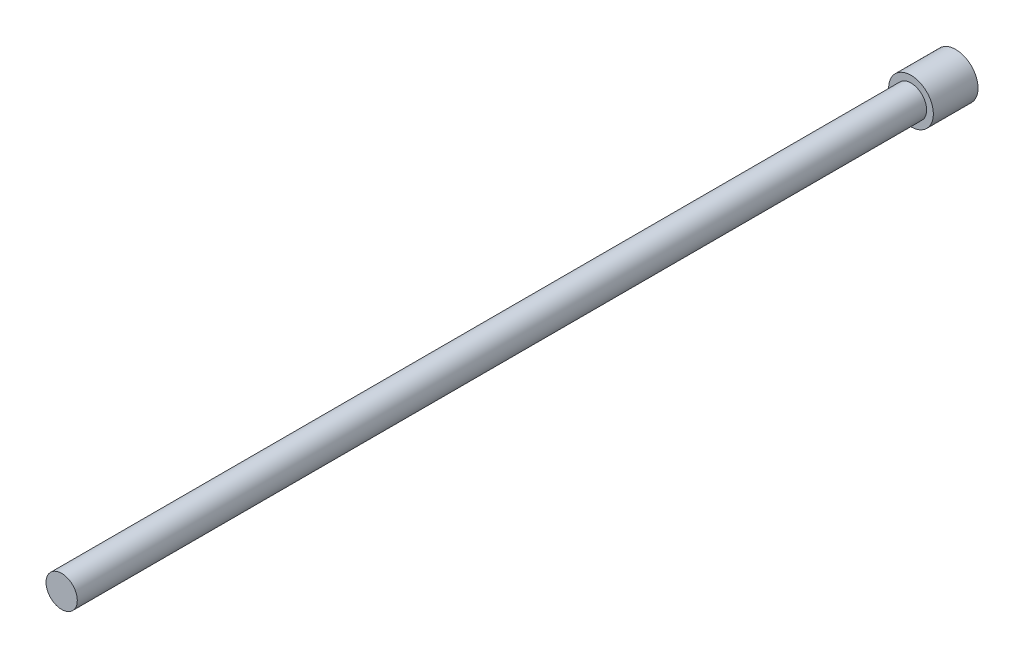
ISO-10303-21;
HEADER;
FILE_DESCRIPTION(('STEP AP214'),'2;1');
FILE_NAME('part.step','',(''),(''),'','','');
FILE_SCHEMA(('AUTOMOTIVE_DESIGN { 1 0 10303 214 1 1 1 1 }'));
ENDSEC;
DATA;
#1=APPLICATION_CONTEXT('core data for automotive mechanical design processes');
#2=APPLICATION_PROTOCOL_DEFINITION('international standard','automotive_design',2000,#1);
#3=PRODUCT_CONTEXT('',#1,'mechanical');
#4=PRODUCT('Part','Part','',(#3));
#5=PRODUCT_RELATED_PRODUCT_CATEGORY('part','',(#4));
#6=PRODUCT_DEFINITION_FORMATION('','',#4);
#7=PRODUCT_DEFINITION_CONTEXT('part definition',#1,'design');
#8=PRODUCT_DEFINITION('design','',#6,#7);
#9=PRODUCT_DEFINITION_SHAPE('','',#8);
#10=(LENGTH_UNIT() NAMED_UNIT(*) SI_UNIT(.MILLI.,.METRE.));
#11=(NAMED_UNIT(*) PLANE_ANGLE_UNIT() SI_UNIT($,.RADIAN.));
#12=(NAMED_UNIT(*) SI_UNIT($,.STERADIAN.) SOLID_ANGLE_UNIT());
#13=UNCERTAINTY_MEASURE_WITH_UNIT(LENGTH_MEASURE(1.E-05),#10,'distance_accuracy_value','');
#14=(GEOMETRIC_REPRESENTATION_CONTEXT(3) GLOBAL_UNCERTAINTY_ASSIGNED_CONTEXT((#13)) GLOBAL_UNIT_ASSIGNED_CONTEXT((#10,
#11,#12)) REPRESENTATION_CONTEXT('',''));
#15=CARTESIAN_POINT('',(0.,0.,0.));
#16=DIRECTION('',(0.,0.,1.));
#17=DIRECTION('',(1.,0.,0.));
#18=AXIS2_PLACEMENT_3D('',#15,#16,#17);
#19=CARTESIAN_POINT('',(0.,0.,200.));
#20=DIRECTION('',(0.,0.,-1.));
#21=DIRECTION('',(-1.,0.,0.));
#22=AXIS2_PLACEMENT_3D('',#19,#20,#21);
#23=CYLINDRICAL_SURFACE('',#22,3.5);
#24=CARTESIAN_POINT('',(0.,0.,200.));
#25=DIRECTION('',(0.,0.,1.));
#26=DIRECTION('',(1.,0.,0.));
#27=AXIS2_PLACEMENT_3D('',#24,#25,#26);
#28=CIRCLE('',#27,3.5);
#29=CARTESIAN_POINT('',(3.5,0.,200.));
#30=VERTEX_POINT('',#29);
#31=EDGE_CURVE('E37',#30,#30,#28,.T.);
#32=ORIENTED_EDGE('',*,*,#31,.F.);
#33=EDGE_LOOP('',(#32));
#34=FACE_BOUND('',#33,.T.);
#35=CARTESIAN_POINT('',(0.,0.,10.));
#36=DIRECTION('',(0.,0.,-1.));
#37=DIRECTION('',(-1.,0.,0.));
#38=AXIS2_PLACEMENT_3D('',#35,#36,#37);
#39=CIRCLE('',#38,3.5);
#40=CARTESIAN_POINT('',(-3.5,0.,10.));
#41=VERTEX_POINT('',#40);
#42=EDGE_CURVE('E10',#41,#41,#39,.T.);
#43=ORIENTED_EDGE('',*,*,#42,.F.);
#44=EDGE_LOOP('',(#43));
#45=FACE_BOUND('',#44,.T.);
#46=ADVANCED_FACE('F31',(#34,#45),#23,.T.);
#47=CARTESIAN_POINT('',(0.,0.,200.));
#48=DIRECTION('',(0.,0.,1.));
#49=DIRECTION('',(1.,0.,0.));
#50=AXIS2_PLACEMENT_3D('',#47,#48,#49);
#51=PLANE('',#50);
#52=ORIENTED_EDGE('',*,*,#31,.T.);
#53=EDGE_LOOP('',(#52));
#54=FACE_BOUND('',#53,.T.);
#55=ADVANCED_FACE('F56',(#54),#51,.T.);
#56=CARTESIAN_POINT('',(0.,0.,10.));
#57=DIRECTION('',(0.,0.,-1.));
#58=DIRECTION('',(-1.,0.,0.));
#59=AXIS2_PLACEMENT_3D('',#56,#57,#58);
#60=CYLINDRICAL_SURFACE('',#59,5.);
#61=CARTESIAN_POINT('',(0.,0.,10.));
#62=DIRECTION('',(0.,0.,-1.));
#63=DIRECTION('',(-1.,0.,0.));
#64=AXIS2_PLACEMENT_3D('',#61,#62,#63);
#65=CIRCLE('',#64,5.);
#66=CARTESIAN_POINT('',(-5.,0.,10.));
#67=VERTEX_POINT('',#66);
#68=EDGE_CURVE('E41',#67,#67,#65,.T.);
#69=ORIENTED_EDGE('',*,*,#68,.T.);
#70=EDGE_LOOP('',(#69));
#71=FACE_BOUND('',#70,.T.);
#72=CARTESIAN_POINT('',(0.,0.,0.));
#73=DIRECTION('',(0.,0.,-1.));
#74=DIRECTION('',(-1.,0.,0.));
#75=AXIS2_PLACEMENT_3D('',#72,#73,#74);
#76=CIRCLE('',#75,5.);
#77=CARTESIAN_POINT('',(-5.,0.,0.));
#78=VERTEX_POINT('',#77);
#79=EDGE_CURVE('E45',#78,#78,#76,.T.);
#80=ORIENTED_EDGE('',*,*,#79,.F.);
#81=EDGE_LOOP('',(#80));
#82=FACE_BOUND('',#81,.T.);
#83=ADVANCED_FACE('F53',(#71,#82),#60,.T.);
#84=CARTESIAN_POINT('',(0.,0.,10.));
#85=DIRECTION('',(0.,0.,-1.));
#86=DIRECTION('',(-1.,0.,0.));
#87=AXIS2_PLACEMENT_3D('',#84,#85,#86);
#88=PLANE('',#87);
#89=ORIENTED_EDGE('',*,*,#42,.T.);
#90=EDGE_LOOP('',(#89));
#91=FACE_BOUND('',#90,.T.);
#92=ORIENTED_EDGE('',*,*,#68,.F.);
#93=EDGE_LOOP('',(#92));
#94=FACE_BOUND('',#93,.T.);
#95=ADVANCED_FACE('F55',(#91,#94),#88,.F.);
#96=CARTESIAN_POINT('',(0.,0.,0.));
#97=DIRECTION('',(0.,0.,1.));
#98=DIRECTION('',(1.,0.,0.));
#99=AXIS2_PLACEMENT_3D('',#96,#97,#98);
#100=PLANE('',#99);
#101=ORIENTED_EDGE('',*,*,#79,.T.);
#102=EDGE_LOOP('',(#101));
#103=FACE_BOUND('',#102,.T.);
#104=ADVANCED_FACE('F51',(#103),#100,.F.);
#105=CLOSED_SHELL('',(#46,#55,#83,#95,#104));
#106=MANIFOLD_SOLID_BREP('B2',#105);
#107=ADVANCED_BREP_SHAPE_REPRESENTATION('',(#18,#106),#14);
#108=SHAPE_DEFINITION_REPRESENTATION(#9,#107);
ENDSEC;
END-ISO-10303-21;
